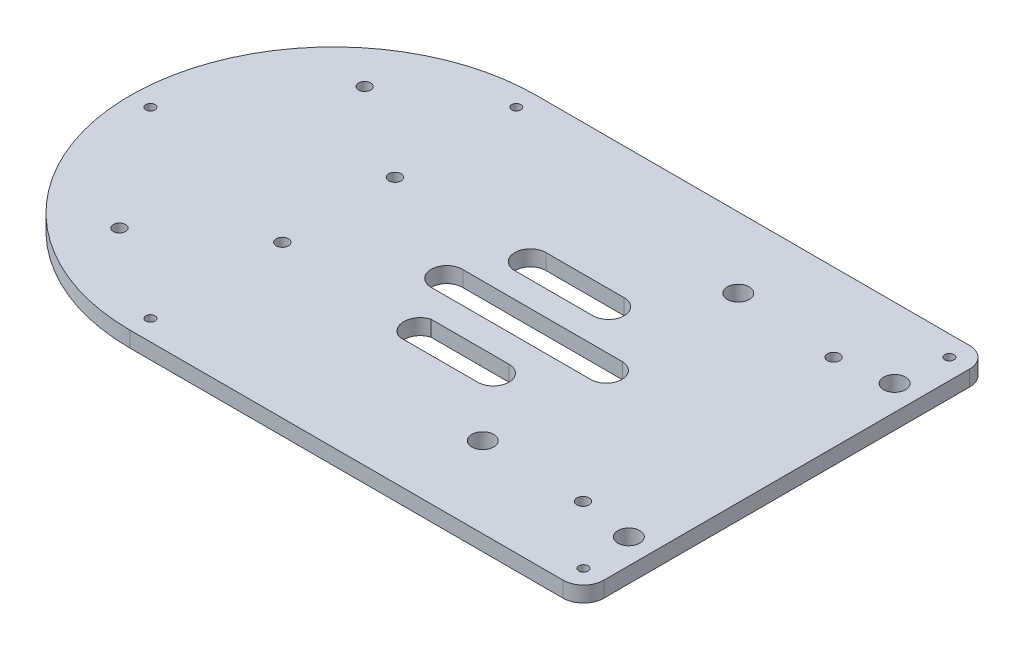
ISO-10303-21;
HEADER;
FILE_DESCRIPTION(('STEP AP214'),'2;1');
FILE_NAME('part.step','',(''),(''),'','','');
FILE_SCHEMA(('AUTOMOTIVE_DESIGN { 1 0 10303 214 1 1 1 1 }'));
ENDSEC;
DATA;
#1=APPLICATION_CONTEXT('core data for automotive mechanical design processes');
#2=APPLICATION_PROTOCOL_DEFINITION('international standard','automotive_design',2000,#1);
#3=PRODUCT_CONTEXT('',#1,'mechanical');
#4=PRODUCT('Part','Part','',(#3));
#5=PRODUCT_RELATED_PRODUCT_CATEGORY('part','',(#4));
#6=PRODUCT_DEFINITION_FORMATION('','',#4);
#7=PRODUCT_DEFINITION_CONTEXT('part definition',#1,'design');
#8=PRODUCT_DEFINITION('design','',#6,#7);
#9=PRODUCT_DEFINITION_SHAPE('','',#8);
#10=(LENGTH_UNIT() NAMED_UNIT(*) SI_UNIT(.MILLI.,.METRE.));
#11=(NAMED_UNIT(*) PLANE_ANGLE_UNIT() SI_UNIT($,.RADIAN.));
#12=(NAMED_UNIT(*) SI_UNIT($,.STERADIAN.) SOLID_ANGLE_UNIT());
#13=UNCERTAINTY_MEASURE_WITH_UNIT(LENGTH_MEASURE(1.E-05),#10,'distance_accuracy_value','');
#14=(GEOMETRIC_REPRESENTATION_CONTEXT(3) GLOBAL_UNCERTAINTY_ASSIGNED_CONTEXT((#13)) GLOBAL_UNIT_ASSIGNED_CONTEXT((#10,
#11,#12)) REPRESENTATION_CONTEXT('',''));
#15=CARTESIAN_POINT('',(0.,0.,0.));
#16=DIRECTION('',(0.,0.,1.));
#17=DIRECTION('',(1.,0.,0.));
#18=AXIS2_PLACEMENT_3D('',#15,#16,#17);
#19=CARTESIAN_POINT('',(70.3364824793313,5.,-56.9191573080477));
#20=DIRECTION('',(0.,-1.,0.));
#21=DIRECTION('',(0.,0.,-1.));
#22=AXIS2_PLACEMENT_3D('',#19,#20,#21);
#23=PLANE('',#22);
#24=CARTESIAN_POINT('',(70.3364824793313,5.,-56.9191573080477));
#25=DIRECTION('',(0.,1.,0.));
#26=DIRECTION('',(0.,0.,1.));
#27=AXIS2_PLACEMENT_3D('',#24,#25,#26);
#28=CIRCLE('',#27,1.475);
#29=CARTESIAN_POINT('',(70.3364824793313,5.,-55.4441573080477));
#30=VERTEX_POINT('',#29);
#31=EDGE_CURVE('E201',#30,#30,#28,.T.);
#32=ORIENTED_EDGE('',*,*,#31,.F.);
#33=EDGE_LOOP('',(#32));
#34=FACE_BOUND('',#33,.T.);
#35=CARTESIAN_POINT('',(68.8364824793313,5.,-40.9192914593731));
#36=DIRECTION('',(0.,1.,0.));
#37=DIRECTION('',(0.,0.,1.));
#38=AXIS2_PLACEMENT_3D('',#35,#36,#37);
#39=CIRCLE('',#38,3.49999999999995);
#40=CARTESIAN_POINT('',(68.8364824793313,5.,-37.4192914593732));
#41=VERTEX_POINT('',#40);
#42=EDGE_CURVE('E207',#41,#41,#39,.T.);
#43=ORIENTED_EDGE('',*,*,#42,.F.);
#44=EDGE_LOOP('',(#43));
#45=FACE_BOUND('',#44,.T.);
#46=CARTESIAN_POINT('',(51.8364824793313,5.,-38.4191573080477));
#47=DIRECTION('',(0.,1.,0.));
#48=DIRECTION('',(0.,0.,1.));
#49=AXIS2_PLACEMENT_3D('',#46,#47,#48);
#50=CIRCLE('',#49,1.95);
#51=CARTESIAN_POINT('',(51.8364824793313,5.,-36.4691573080477));
#52=VERTEX_POINT('',#51);
#53=EDGE_CURVE('E213',#52,#52,#50,.T.);
#54=ORIENTED_EDGE('',*,*,#53,.F.);
#55=EDGE_LOOP('',(#54));
#56=FACE_BOUND('',#55,.T.);
#57=CARTESIAN_POINT('',(-98.1635175206687,5.,-38.4191573080472));
#58=DIRECTION('',(0.,1.,0.));
#59=DIRECTION('',(0.,0.,1.));
#60=AXIS2_PLACEMENT_3D('',#57,#58,#59);
#61=CIRCLE('',#60,1.95);
#62=CARTESIAN_POINT('',(-98.1635175206687,5.,-36.4691573080472));
#63=VERTEX_POINT('',#62);
#64=EDGE_CURVE('E219',#63,#63,#61,.T.);
#65=ORIENTED_EDGE('',*,*,#64,.F.);
#66=EDGE_LOOP('',(#65));
#67=FACE_BOUND('',#66,.T.);
#68=CARTESIAN_POINT('',(-68.1635175206687,5.,-18.1096480939233));
#69=DIRECTION('',(0.,1.,0.));
#70=DIRECTION('',(0.,0.,1.));
#71=AXIS2_PLACEMENT_3D('',#68,#69,#70);
#72=CIRCLE('',#71,1.975);
#73=CARTESIAN_POINT('',(-68.1635175206687,5.,-16.1346480939233));
#74=VERTEX_POINT('',#73);
#75=EDGE_CURVE('E225',#74,#74,#72,.T.);
#76=ORIENTED_EDGE('',*,*,#75,.F.);
#77=EDGE_LOOP('',(#76));
#78=FACE_BOUND('',#77,.T.);
#79=CARTESIAN_POINT('',(18.8364824793314,5.,-40.9192914593731));
#80=DIRECTION('',(0.,1.,0.));
#81=DIRECTION('',(0.,0.,1.));
#82=AXIS2_PLACEMENT_3D('',#79,#80,#81);
#83=CIRCLE('',#82,3.5);
#84=CARTESIAN_POINT('',(18.8364824793314,5.,-37.4192914593731));
#85=VERTEX_POINT('',#84);
#86=EDGE_CURVE('E231',#85,#85,#83,.T.);
#87=ORIENTED_EDGE('',*,*,#86,.F.);
#88=EDGE_LOOP('',(#87));
#89=FACE_BOUND('',#88,.T.);
#90=CARTESIAN_POINT('',(-23.1635172737145,5.,-16.4191573459248));
#91=DIRECTION('',(0.,1.,0.));
#92=DIRECTION('',(0.,0.,1.));
#93=AXIS2_PLACEMENT_3D('',#90,#91,#92);
#94=CIRCLE('',#93,5.);
#95=CARTESIAN_POINT('',(-23.1635172737145,5.,-21.4191573459248));
#96=VERTEX_POINT('',#95);
#97=CARTESIAN_POINT('',(-23.1635172737145,5.,-11.4191573459248));
#98=VERTEX_POINT('',#97);
#99=EDGE_CURVE('E237',#96,#98,#94,.T.);
#100=ORIENTED_EDGE('',*,*,#99,.F.);
#101=DIRECTION('',(-1.,0.,0.));
#102=VECTOR('',#101,1.);
#103=CARTESIAN_POINT('',(-23.1635172737145,5.,-21.4191573459248));
#104=LINE('',#103,#102);
#105=CARTESIAN_POINT('',(1.8364824793313,5.,-21.4191573459248));
#106=VERTEX_POINT('',#105);
#107=EDGE_CURVE('E245',#106,#96,#104,.T.);
#108=ORIENTED_EDGE('',*,*,#107,.F.);
#109=CARTESIAN_POINT('',(1.83648247933132,5.,-16.4191573459248));
#110=DIRECTION('',(0.,1.,0.));
#111=DIRECTION('',(0.,0.,-1.));
#112=AXIS2_PLACEMENT_3D('',#109,#110,#111);
#113=CIRCLE('',#112,5.);
#114=CARTESIAN_POINT('',(1.83648247933133,5.,-11.4191573459248));
#115=VERTEX_POINT('',#114);
#116=EDGE_CURVE('E242',#115,#106,#113,.T.);
#117=ORIENTED_EDGE('',*,*,#116,.F.);
#118=DIRECTION('',(1.,0.,0.));
#119=VECTOR('',#118,1.);
#120=CARTESIAN_POINT('',(-23.1635172737145,5.,-11.4191573459248));
#121=LINE('',#120,#119);
#122=EDGE_CURVE('E239',#98,#115,#121,.T.);
#123=ORIENTED_EDGE('',*,*,#122,.F.);
#124=EDGE_LOOP('',(#100,#108,#117,#123));
#125=FACE_BOUND('',#124,.T.);
#126=CARTESIAN_POINT('',(70.3364824793313,5.,-56.9191573080477));
#127=DIRECTION('',(0.,1.,0.));
#128=DIRECTION('',(0.,0.,-1.));
#129=AXIS2_PLACEMENT_3D('',#126,#127,#128);
#130=CIRCLE('',#129,6.5);
#131=CARTESIAN_POINT('',(76.8364824793313,5.,-56.9191573080477));
#132=VERTEX_POINT('',#131);
#133=CARTESIAN_POINT('',(70.3364824793313,5.,-63.4191573080476));
#134=VERTEX_POINT('',#133);
#135=EDGE_CURVE('E299',#132,#134,#130,.T.);
#136=ORIENTED_EDGE('',*,*,#135,.T.);
#137=DIRECTION('',(-1.,0.,0.));
#138=VECTOR('',#137,1.);
#139=CARTESIAN_POINT('',(70.3364824793313,5.,-63.4191573080476));
#140=LINE('',#139,#138);
#141=CARTESIAN_POINT('',(-68.1635175206687,5.,-63.4191573080476));
#142=VERTEX_POINT('',#141);
#143=EDGE_CURVE('E302',#134,#142,#140,.T.);
#144=ORIENTED_EDGE('',*,*,#143,.T.);
#145=CARTESIAN_POINT('',(-68.1666068794609,5.,1.58084261853593));
#146=DIRECTION('',(0.,1.,0.));
#147=DIRECTION('',(0.,0.,1.));
#148=AXIS2_PLACEMENT_3D('',#145,#146,#147);
#149=CIRCLE('',#148,65.);
#150=CARTESIAN_POINT('',(-68.1635175206686,5.,66.5808425451195));
#151=VERTEX_POINT('',#150);
#152=EDGE_CURVE('E305',#142,#151,#149,.T.);
#153=ORIENTED_EDGE('',*,*,#152,.T.);
#154=DIRECTION('',(1.,0.,1.06016509249762E-09));
#155=VECTOR('',#154,1.);
#156=CARTESIAN_POINT('',(70.3364824793313,5.,66.5808426919524));
#157=LINE('',#156,#155);
#158=CARTESIAN_POINT('',(70.3364824793313,5.,66.5808426919523));
#159=VERTEX_POINT('',#158);
#160=EDGE_CURVE('E307',#151,#159,#157,.T.);
#161=ORIENTED_EDGE('',*,*,#160,.T.);
#162=CARTESIAN_POINT('',(70.3364824793313,5.,60.0808426919523));
#163=DIRECTION('',(0.,1.,0.));
#164=DIRECTION('',(0.,0.,1.));
#165=AXIS2_PLACEMENT_3D('',#162,#163,#164);
#166=CIRCLE('',#165,6.5);
#167=CARTESIAN_POINT('',(76.8364824793313,5.,60.0808425451196));
#168=VERTEX_POINT('',#167);
#169=EDGE_CURVE('E309',#159,#168,#166,.T.);
#170=ORIENTED_EDGE('',*,*,#169,.T.);
#171=DIRECTION('',(0.,0.,-1.));
#172=VECTOR('',#171,1.);
#173=CARTESIAN_POINT('',(76.8364824793313,5.,-56.9191573080477));
#174=LINE('',#173,#172);
#175=EDGE_CURVE('E311',#168,#132,#174,.T.);
#176=ORIENTED_EDGE('',*,*,#175,.T.);
#177=EDGE_LOOP('',(#136,#144,#153,#161,#170,#176));
#178=FACE_BOUND('',#177,.T.);
#179=CARTESIAN_POINT('',(-31.8788270323601,5.,1.58084265407521));
#180=DIRECTION('',(0.,1.,0.));
#181=DIRECTION('',(0.,0.,1.));
#182=AXIS2_PLACEMENT_3D('',#179,#180,#181);
#183=CIRCLE('',#182,5.00463367149133);
#184=CARTESIAN_POINT('',(-31.6635175206687,5.,-3.41915734592479));
#185=VERTEX_POINT('',#184);
#186=CARTESIAN_POINT('',(-32.0941365440516,5.,6.58084265407521));
#187=VERTEX_POINT('',#186);
#188=EDGE_CURVE('E268',#185,#187,#183,.T.);
#189=ORIENTED_EDGE('',*,*,#188,.F.);
#190=DIRECTION('',(-1.,0.,0.));
#191=VECTOR('',#190,1.);
#192=CARTESIAN_POINT('',(-31.6635175206687,5.,-3.41915734592479));
#193=LINE('',#192,#191);
#194=CARTESIAN_POINT('',(19.3364824793313,5.,-3.41915734592479));
#195=VERTEX_POINT('',#194);
#196=EDGE_CURVE('E276',#195,#185,#193,.T.);
#197=ORIENTED_EDGE('',*,*,#196,.F.);
#198=CARTESIAN_POINT('',(19.1211729676399,5.,1.58084265407521));
#199=DIRECTION('',(0.,1.,0.));
#200=DIRECTION('',(0.,0.,-1.));
#201=AXIS2_PLACEMENT_3D('',#198,#199,#200);
#202=CIRCLE('',#201,5.00463367149132);
#203=CARTESIAN_POINT('',(18.9058634559484,5.,6.5808426540752));
#204=VERTEX_POINT('',#203);
#205=EDGE_CURVE('E273',#204,#195,#202,.T.);
#206=ORIENTED_EDGE('',*,*,#205,.F.);
#207=DIRECTION('',(1.,0.,0.));
#208=VECTOR('',#207,1.);
#209=CARTESIAN_POINT('',(-32.0941365440516,5.,6.58084265407521));
#210=LINE('',#209,#208);
#211=EDGE_CURVE('E270',#187,#204,#210,.T.);
#212=ORIENTED_EDGE('',*,*,#211,.F.);
#213=EDGE_LOOP('',(#189,#197,#206,#212));
#214=FACE_BOUND('',#213,.T.);
#215=CARTESIAN_POINT('',(1.83339312053904,5.,20.4196532693301));
#216=DIRECTION('',(0.,1.,0.));
#217=DIRECTION('',(0.,0.,1.));
#218=AXIS2_PLACEMENT_3D('',#215,#216,#217);
#219=CIRCLE('',#218,5.);
#220=CARTESIAN_POINT('',(1.83339312053903,5.,25.4196532693301));
#221=VERTEX_POINT('',#220);
#222=CARTESIAN_POINT('',(1.83339312053904,5.,15.4196532693301));
#223=VERTEX_POINT('',#222);
#224=EDGE_CURVE('E162',#221,#223,#219,.T.);
#225=ORIENTED_EDGE('',*,*,#224,.F.);
#226=DIRECTION('',(1.,0.,0.));
#227=VECTOR('',#226,1.);
#228=CARTESIAN_POINT('',(-23.166606879461,5.,25.4196532693301));
#229=LINE('',#228,#227);
#230=CARTESIAN_POINT('',(-23.166606879461,5.,25.4196532693301));
#231=VERTEX_POINT('',#230);
#232=EDGE_CURVE('E185',#231,#221,#229,.T.);
#233=ORIENTED_EDGE('',*,*,#232,.F.);
#234=CARTESIAN_POINT('',(-21.5232173098339,5.,20.4196532693301));
#235=DIRECTION('',(0.,1.,0.));
#236=DIRECTION('',(0.,0.,1.));
#237=AXIS2_PLACEMENT_3D('',#234,#235,#236);
#238=CIRCLE('',#237,5.26314822872767);
#239=CARTESIAN_POINT('',(-23.166606879461,5.,15.4196532693301));
#240=VERTEX_POINT('',#239);
#241=EDGE_CURVE('E183',#240,#231,#238,.T.);
#242=ORIENTED_EDGE('',*,*,#241,.F.);
#243=DIRECTION('',(-1.,0.,0.));
#244=VECTOR('',#243,1.);
#245=CARTESIAN_POINT('',(-23.166606879461,5.,15.4196532693301));
#246=LINE('',#245,#244);
#247=EDGE_CURVE('E170',#223,#240,#246,.T.);
#248=ORIENTED_EDGE('',*,*,#247,.F.);
#249=EDGE_LOOP('',(#225,#233,#242,#248));
#250=FACE_BOUND('',#249,.T.);
#251=CARTESIAN_POINT('',(18.8364824793314,5.,40.8007481239956));
#252=DIRECTION('',(0.,1.,0.));
#253=DIRECTION('',(0.,0.,-1.));
#254=AXIS2_PLACEMENT_3D('',#251,#252,#253);
#255=CIRCLE('',#254,3.5);
#256=CARTESIAN_POINT('',(18.8364824793314,5.,37.3007481239956));
#257=VERTEX_POINT('',#256);
#258=EDGE_CURVE('E191',#257,#257,#255,.T.);
#259=ORIENTED_EDGE('',*,*,#258,.F.);
#260=EDGE_LOOP('',(#259));
#261=FACE_BOUND('',#260,.T.);
#262=CARTESIAN_POINT('',(70.3364824793313,5.,60.0808426919523));
#263=DIRECTION('',(0.,1.,0.));
#264=DIRECTION('',(0.,0.,-1.));
#265=AXIS2_PLACEMENT_3D('',#262,#263,#264);
#266=CIRCLE('',#265,1.47500000000001);
#267=CARTESIAN_POINT('',(70.3364824793313,5.,58.6058426919523));
#268=VERTEX_POINT('',#267);
#269=EDGE_CURVE('E537',#268,#268,#266,.T.);
#270=ORIENTED_EDGE('',*,*,#269,.F.);
#271=EDGE_LOOP('',(#270));
#272=FACE_BOUND('',#271,.T.);
#273=CARTESIAN_POINT('',(51.685487166698,5.,41.5807001944227));
#274=DIRECTION('',(0.,1.,0.));
#275=DIRECTION('',(0.,0.,-1.));
#276=AXIS2_PLACEMENT_3D('',#273,#274,#275);
#277=CIRCLE('',#276,1.95);
#278=CARTESIAN_POINT('',(51.685487166698,5.,39.6307001944227));
#279=VERTEX_POINT('',#278);
#280=EDGE_CURVE('E531',#279,#279,#277,.T.);
#281=ORIENTED_EDGE('',*,*,#280,.F.);
#282=EDGE_LOOP('',(#281));
#283=FACE_BOUND('',#282,.T.);
#284=CARTESIAN_POINT('',(68.8364824793313,5.,44.0807085406269));
#285=DIRECTION('',(0.,1.,0.));
#286=DIRECTION('',(0.,0.,-1.));
#287=AXIS2_PLACEMENT_3D('',#284,#285,#286);
#288=CIRCLE('',#287,3.50000000000001);
#289=CARTESIAN_POINT('',(68.8364824793313,5.,40.5807085406269));
#290=VERTEX_POINT('',#289);
#291=EDGE_CURVE('E525',#290,#290,#288,.T.);
#292=ORIENTED_EDGE('',*,*,#291,.F.);
#293=EDGE_LOOP('',(#292));
#294=FACE_BOUND('',#293,.T.);
#295=CARTESIAN_POINT('',(-68.1635175206687,5.,-56.9191573080476));
#296=DIRECTION('',(0.,1.,0.));
#297=DIRECTION('',(0.,0.,1.));
#298=AXIS2_PLACEMENT_3D('',#295,#296,#297);
#299=CIRCLE('',#298,1.475);
#300=CARTESIAN_POINT('',(-68.1635175206687,5.,-55.4441573080477));
#301=VERTEX_POINT('',#300);
#302=EDGE_CURVE('E519',#301,#301,#299,.T.);
#303=ORIENTED_EDGE('',*,*,#302,.F.);
#304=EDGE_LOOP('',(#303));
#305=FACE_BOUND('',#304,.T.);
#306=CARTESIAN_POINT('',(-68.1635175206687,5.,17.8903519060767));
#307=DIRECTION('',(0.,1.,0.));
#308=DIRECTION('',(0.,0.,-1.));
#309=AXIS2_PLACEMENT_3D('',#306,#307,#308);
#310=CIRCLE('',#309,1.975);
#311=CARTESIAN_POINT('',(-68.1635175206687,5.,15.9153519060767));
#312=VERTEX_POINT('',#311);
#313=EDGE_CURVE('E513',#312,#312,#310,.T.);
#314=ORIENTED_EDGE('',*,*,#313,.F.);
#315=EDGE_LOOP('',(#314));
#316=FACE_BOUND('',#315,.T.);
#317=CARTESIAN_POINT('',(-98.1635175206687,5.,40.0000000355393));
#318=DIRECTION('',(0.,1.,0.));
#319=DIRECTION('',(0.,0.,-1.));
#320=AXIS2_PLACEMENT_3D('',#317,#318,#319);
#321=CIRCLE('',#320,1.95);
#322=CARTESIAN_POINT('',(-98.1635175206687,5.,38.0500000355393));
#323=VERTEX_POINT('',#322);
#324=EDGE_CURVE('E507',#323,#323,#321,.T.);
#325=ORIENTED_EDGE('',*,*,#324,.F.);
#326=EDGE_LOOP('',(#325));
#327=FACE_BOUND('',#326,.T.);
#328=CARTESIAN_POINT('',(-68.1635175206687,5.,60.0808425451195));
#329=DIRECTION('',(0.,1.,0.));
#330=DIRECTION('',(0.,0.,-1.));
#331=AXIS2_PLACEMENT_3D('',#328,#329,#330);
#332=CIRCLE('',#331,1.475);
#333=CARTESIAN_POINT('',(-68.1635175206687,5.,58.6058425451195));
#334=VERTEX_POINT('',#333);
#335=EDGE_CURVE('E501',#334,#334,#332,.T.);
#336=ORIENTED_EDGE('',*,*,#335,.F.);
#337=EDGE_LOOP('',(#336));
#338=FACE_BOUND('',#337,.T.);
#339=CARTESIAN_POINT('',(-126.663517520669,5.,1.58084261853595));
#340=DIRECTION('',(0.,1.,0.));
#341=DIRECTION('',(0.,0.,1.));
#342=AXIS2_PLACEMENT_3D('',#339,#340,#341);
#343=CIRCLE('',#342,1.47500000000001);
#344=CARTESIAN_POINT('',(-126.663517520669,5.,3.05584261853597));
#345=VERTEX_POINT('',#344);
#346=EDGE_CURVE('E492',#345,#345,#343,.T.);
#347=ORIENTED_EDGE('',*,*,#346,.F.);
#348=EDGE_LOOP('',(#347));
#349=FACE_BOUND('',#348,.T.);
#350=ADVANCED_FACE('F37',(#34,#45,#56,#67,#78,#89,#125,#178,#214,#250,#261,#272,#283,#294,#305,
#316,#327,#338,#349),#23,.F.);
#351=CARTESIAN_POINT('',(70.3364824793313,0.,-56.9191573080477));
#352=DIRECTION('',(0.,-1.,0.));
#353=DIRECTION('',(0.,0.,-1.));
#354=AXIS2_PLACEMENT_3D('',#351,#352,#353);
#355=PLANE('',#354);
#356=CARTESIAN_POINT('',(-68.1635175206687,0.,60.0808425451195));
#357=DIRECTION('',(0.,1.,0.));
#358=DIRECTION('',(0.,0.,-1.));
#359=AXIS2_PLACEMENT_3D('',#356,#357,#358);
#360=CIRCLE('',#359,1.475);
#361=CARTESIAN_POINT('',(-68.1635175206687,0.,58.6058425451195));
#362=VERTEX_POINT('',#361);
#363=EDGE_CURVE('E498',#362,#362,#360,.T.);
#364=ORIENTED_EDGE('',*,*,#363,.T.);
#365=EDGE_LOOP('',(#364));
#366=FACE_BOUND('',#365,.T.);
#367=CARTESIAN_POINT('',(-68.1635175206687,0.,17.8903519060767));
#368=DIRECTION('',(0.,1.,0.));
#369=DIRECTION('',(0.,0.,-1.));
#370=AXIS2_PLACEMENT_3D('',#367,#368,#369);
#371=CIRCLE('',#370,1.975);
#372=CARTESIAN_POINT('',(-68.1635175206687,0.,15.9153519060767));
#373=VERTEX_POINT('',#372);
#374=EDGE_CURVE('E510',#373,#373,#371,.T.);
#375=ORIENTED_EDGE('',*,*,#374,.T.);
#376=EDGE_LOOP('',(#375));
#377=FACE_BOUND('',#376,.T.);
#378=CARTESIAN_POINT('',(68.8364824793313,0.,44.0807085406269));
#379=DIRECTION('',(0.,1.,0.));
#380=DIRECTION('',(0.,0.,-1.));
#381=AXIS2_PLACEMENT_3D('',#378,#379,#380);
#382=CIRCLE('',#381,3.50000000000001);
#383=CARTESIAN_POINT('',(68.8364824793313,0.,40.5807085406269));
#384=VERTEX_POINT('',#383);
#385=EDGE_CURVE('E522',#384,#384,#382,.T.);
#386=ORIENTED_EDGE('',*,*,#385,.T.);
#387=EDGE_LOOP('',(#386));
#388=FACE_BOUND('',#387,.T.);
#389=CARTESIAN_POINT('',(70.3364824793313,0.,60.0808426919523));
#390=DIRECTION('',(0.,1.,0.));
#391=DIRECTION('',(0.,0.,-1.));
#392=AXIS2_PLACEMENT_3D('',#389,#390,#391);
#393=CIRCLE('',#392,1.47500000000001);
#394=CARTESIAN_POINT('',(70.3364824793313,0.,58.6058426919523));
#395=VERTEX_POINT('',#394);
#396=EDGE_CURVE('E534',#395,#395,#393,.T.);
#397=ORIENTED_EDGE('',*,*,#396,.T.);
#398=EDGE_LOOP('',(#397));
#399=FACE_BOUND('',#398,.T.);
#400=DIRECTION('',(1.,0.,0.));
#401=VECTOR('',#400,1.);
#402=CARTESIAN_POINT('',(-23.166606879461,0.,25.4196532693301));
#403=LINE('',#402,#401);
#404=CARTESIAN_POINT('',(-23.166606879461,0.,25.4196532693301));
#405=VERTEX_POINT('',#404);
#406=CARTESIAN_POINT('',(1.83339312053903,0.,25.4196532693301));
#407=VERTEX_POINT('',#406);
#408=EDGE_CURVE('E171',#405,#407,#403,.T.);
#409=ORIENTED_EDGE('',*,*,#408,.T.);
#410=CARTESIAN_POINT('',(1.83339312053904,0.,20.4196532693301));
#411=DIRECTION('',(0.,1.,0.));
#412=DIRECTION('',(0.,0.,1.));
#413=AXIS2_PLACEMENT_3D('',#410,#411,#412);
#414=CIRCLE('',#413,5.);
#415=CARTESIAN_POINT('',(1.83339312053904,0.,15.4196532693301));
#416=VERTEX_POINT('',#415);
#417=EDGE_CURVE('E60',#407,#416,#414,.T.);
#418=ORIENTED_EDGE('',*,*,#417,.T.);
#419=DIRECTION('',(-1.,0.,0.));
#420=VECTOR('',#419,1.);
#421=CARTESIAN_POINT('',(-23.166606879461,0.,15.4196532693301));
#422=LINE('',#421,#420);
#423=CARTESIAN_POINT('',(-23.166606879461,0.,15.4196532693301));
#424=VERTEX_POINT('',#423);
#425=EDGE_CURVE('E177',#416,#424,#422,.T.);
#426=ORIENTED_EDGE('',*,*,#425,.T.);
#427=CARTESIAN_POINT('',(-21.5232173098339,0.,20.4196532693301));
#428=DIRECTION('',(0.,1.,0.));
#429=DIRECTION('',(0.,0.,1.));
#430=AXIS2_PLACEMENT_3D('',#427,#428,#429);
#431=CIRCLE('',#430,5.26314822872767);
#432=EDGE_CURVE('E193',#424,#405,#431,.T.);
#433=ORIENTED_EDGE('',*,*,#432,.T.);
#434=EDGE_LOOP('',(#409,#418,#426,#433));
#435=FACE_BOUND('',#434,.T.);
#436=CARTESIAN_POINT('',(70.3364824793313,0.,-56.9191573080477));
#437=DIRECTION('',(0.,1.,0.));
#438=DIRECTION('',(0.,0.,1.));
#439=AXIS2_PLACEMENT_3D('',#436,#437,#438);
#440=CIRCLE('',#439,1.475);
#441=CARTESIAN_POINT('',(70.3364824793313,0.,-55.4441573080477));
#442=VERTEX_POINT('',#441);
#443=EDGE_CURVE('E178',#442,#442,#440,.T.);
#444=ORIENTED_EDGE('',*,*,#443,.T.);
#445=EDGE_LOOP('',(#444));
#446=FACE_BOUND('',#445,.T.);
#447=CARTESIAN_POINT('',(51.8364824793313,0.,-38.4191573080477));
#448=DIRECTION('',(0.,1.,0.));
#449=DIRECTION('',(0.,0.,1.));
#450=AXIS2_PLACEMENT_3D('',#447,#448,#449);
#451=CIRCLE('',#450,1.95);
#452=CARTESIAN_POINT('',(51.8364824793313,0.,-36.4691573080477));
#453=VERTEX_POINT('',#452);
#454=EDGE_CURVE('E210',#453,#453,#451,.T.);
#455=ORIENTED_EDGE('',*,*,#454,.T.);
#456=EDGE_LOOP('',(#455));
#457=FACE_BOUND('',#456,.T.);
#458=CARTESIAN_POINT('',(-68.1635175206687,0.,-18.1096480939233));
#459=DIRECTION('',(0.,1.,0.));
#460=DIRECTION('',(0.,0.,1.));
#461=AXIS2_PLACEMENT_3D('',#458,#459,#460);
#462=CIRCLE('',#461,1.975);
#463=CARTESIAN_POINT('',(-68.1635175206687,0.,-16.1346480939233));
#464=VERTEX_POINT('',#463);
#465=EDGE_CURVE('E222',#464,#464,#462,.T.);
#466=ORIENTED_EDGE('',*,*,#465,.T.);
#467=EDGE_LOOP('',(#466));
#468=FACE_BOUND('',#467,.T.);
#469=DIRECTION('',(-1.,0.,0.));
#470=VECTOR('',#469,1.);
#471=CARTESIAN_POINT('',(-23.1635172737145,0.,-21.4191573459248));
#472=LINE('',#471,#470);
#473=CARTESIAN_POINT('',(1.8364824793313,0.,-21.4191573459248));
#474=VERTEX_POINT('',#473);
#475=CARTESIAN_POINT('',(-23.1635172737145,0.,-21.4191573459248));
#476=VERTEX_POINT('',#475);
#477=EDGE_CURVE('E240',#474,#476,#472,.T.);
#478=ORIENTED_EDGE('',*,*,#477,.T.);
#479=CARTESIAN_POINT('',(-23.1635172737145,0.,-16.4191573459248));
#480=DIRECTION('',(0.,1.,0.));
#481=DIRECTION('',(0.,0.,1.));
#482=AXIS2_PLACEMENT_3D('',#479,#480,#481);
#483=CIRCLE('',#482,5.);
#484=CARTESIAN_POINT('',(-23.1635172737145,0.,-11.4191573459248));
#485=VERTEX_POINT('',#484);
#486=EDGE_CURVE('E234',#476,#485,#483,.T.);
#487=ORIENTED_EDGE('',*,*,#486,.T.);
#488=DIRECTION('',(1.,0.,0.));
#489=VECTOR('',#488,1.);
#490=CARTESIAN_POINT('',(-23.1635172737145,0.,-11.4191573459248));
#491=LINE('',#490,#489);
#492=CARTESIAN_POINT('',(1.83648247933133,0.,-11.4191573459248));
#493=VERTEX_POINT('',#492);
#494=EDGE_CURVE('E250',#485,#493,#491,.T.);
#495=ORIENTED_EDGE('',*,*,#494,.T.);
#496=CARTESIAN_POINT('',(1.83648247933132,0.,-16.4191573459248));
#497=DIRECTION('',(0.,1.,0.));
#498=DIRECTION('',(0.,0.,-1.));
#499=AXIS2_PLACEMENT_3D('',#496,#497,#498);
#500=CIRCLE('',#499,5.);
#501=EDGE_CURVE('E253',#493,#474,#500,.T.);
#502=ORIENTED_EDGE('',*,*,#501,.T.);
#503=EDGE_LOOP('',(#478,#487,#495,#502));
#504=FACE_BOUND('',#503,.T.);
#505=DIRECTION('',(-1.,0.,0.));
#506=VECTOR('',#505,1.);
#507=CARTESIAN_POINT('',(-31.6635175206687,0.,-3.41915734592479));
#508=LINE('',#507,#506);
#509=CARTESIAN_POINT('',(19.3364824793313,0.,-3.41915734592479));
#510=VERTEX_POINT('',#509);
#511=CARTESIAN_POINT('',(-31.6635175206687,0.,-3.41915734592479));
#512=VERTEX_POINT('',#511);
#513=EDGE_CURVE('E271',#510,#512,#508,.T.);
#514=ORIENTED_EDGE('',*,*,#513,.T.);
#515=CARTESIAN_POINT('',(-31.8788270323601,0.,1.58084265407521));
#516=DIRECTION('',(0.,1.,0.));
#517=DIRECTION('',(0.,0.,1.));
#518=AXIS2_PLACEMENT_3D('',#515,#516,#517);
#519=CIRCLE('',#518,5.00463367149133);
#520=CARTESIAN_POINT('',(-32.0941365440516,0.,6.58084265407521));
#521=VERTEX_POINT('',#520);
#522=EDGE_CURVE('E267',#512,#521,#519,.T.);
#523=ORIENTED_EDGE('',*,*,#522,.T.);
#524=DIRECTION('',(1.,0.,0.));
#525=VECTOR('',#524,1.);
#526=CARTESIAN_POINT('',(-32.0941365440516,0.,6.58084265407521));
#527=LINE('',#526,#525);
#528=CARTESIAN_POINT('',(18.9058634559484,0.,6.5808426540752));
#529=VERTEX_POINT('',#528);
#530=EDGE_CURVE('E281',#521,#529,#527,.T.);
#531=ORIENTED_EDGE('',*,*,#530,.T.);
#532=CARTESIAN_POINT('',(19.1211729676399,0.,1.58084265407521));
#533=DIRECTION('',(0.,1.,0.));
#534=DIRECTION('',(0.,0.,-1.));
#535=AXIS2_PLACEMENT_3D('',#532,#533,#534);
#536=CIRCLE('',#535,5.00463367149132);
#537=EDGE_CURVE('E284',#529,#510,#536,.T.);
#538=ORIENTED_EDGE('',*,*,#537,.T.);
#539=EDGE_LOOP('',(#514,#523,#531,#538));
#540=FACE_BOUND('',#539,.T.);
#541=CARTESIAN_POINT('',(70.3364824793313,0.,-56.9191573080477));
#542=DIRECTION('',(0.,1.,0.));
#543=DIRECTION('',(0.,0.,-1.));
#544=AXIS2_PLACEMENT_3D('',#541,#542,#543);
#545=CIRCLE('',#544,6.5);
#546=CARTESIAN_POINT('',(76.8364824793313,0.,-56.9191573080477));
#547=VERTEX_POINT('',#546);
#548=CARTESIAN_POINT('',(70.3364824793313,0.,-63.4191573080476));
#549=VERTEX_POINT('',#548);
#550=EDGE_CURVE('E298',#547,#549,#545,.T.);
#551=ORIENTED_EDGE('',*,*,#550,.F.);
#552=DIRECTION('',(0.,0.,-1.));
#553=VECTOR('',#552,1.);
#554=CARTESIAN_POINT('',(76.8364824793313,0.,-56.9191573080477));
#555=LINE('',#554,#553);
#556=CARTESIAN_POINT('',(76.8364824793313,0.,60.0808425451196));
#557=VERTEX_POINT('',#556);
#558=EDGE_CURVE('E303',#557,#547,#555,.T.);
#559=ORIENTED_EDGE('',*,*,#558,.F.);
#560=CARTESIAN_POINT('',(70.3364824793313,0.,60.0808426919523));
#561=DIRECTION('',(0.,1.,0.));
#562=DIRECTION('',(0.,0.,1.));
#563=AXIS2_PLACEMENT_3D('',#560,#561,#562);
#564=CIRCLE('',#563,6.5);
#565=CARTESIAN_POINT('',(70.3364824793313,0.,66.5808426919523));
#566=VERTEX_POINT('',#565);
#567=EDGE_CURVE('E322',#566,#557,#564,.T.);
#568=ORIENTED_EDGE('',*,*,#567,.F.);
#569=DIRECTION('',(1.,0.,1.06016509249762E-09));
#570=VECTOR('',#569,1.);
#571=CARTESIAN_POINT('',(70.3364824793313,0.,66.5808426919524));
#572=LINE('',#571,#570);
#573=CARTESIAN_POINT('',(-68.1635175206686,0.,66.5808425451195));
#574=VERTEX_POINT('',#573);
#575=EDGE_CURVE('E320',#574,#566,#572,.T.);
#576=ORIENTED_EDGE('',*,*,#575,.F.);
#577=CARTESIAN_POINT('',(-68.1666068794609,0.,1.58084261853593));
#578=DIRECTION('',(0.,1.,0.));
#579=DIRECTION('',(0.,0.,1.));
#580=AXIS2_PLACEMENT_3D('',#577,#578,#579);
#581=CIRCLE('',#580,65.);
#582=CARTESIAN_POINT('',(-68.1635175206687,0.,-63.4191573080476));
#583=VERTEX_POINT('',#582);
#584=EDGE_CURVE('E318',#583,#574,#581,.T.);
#585=ORIENTED_EDGE('',*,*,#584,.F.);
#586=DIRECTION('',(-1.,0.,0.));
#587=VECTOR('',#586,1.);
#588=CARTESIAN_POINT('',(70.3364824793313,0.,-63.4191573080476));
#589=LINE('',#588,#587);
#590=EDGE_CURVE('E316',#549,#583,#589,.T.);
#591=ORIENTED_EDGE('',*,*,#590,.F.);
#592=EDGE_LOOP('',(#551,#559,#568,#576,#585,#591));
#593=FACE_BOUND('',#592,.T.);
#594=CARTESIAN_POINT('',(18.8364824793314,0.,-40.9192914593731));
#595=DIRECTION('',(0.,1.,0.));
#596=DIRECTION('',(0.,0.,1.));
#597=AXIS2_PLACEMENT_3D('',#594,#595,#596);
#598=CIRCLE('',#597,3.5);
#599=CARTESIAN_POINT('',(18.8364824793314,0.,-37.4192914593731));
#600=VERTEX_POINT('',#599);
#601=EDGE_CURVE('E228',#600,#600,#598,.T.);
#602=ORIENTED_EDGE('',*,*,#601,.T.);
#603=EDGE_LOOP('',(#602));
#604=FACE_BOUND('',#603,.T.);
#605=CARTESIAN_POINT('',(-98.1635175206687,0.,-38.4191573080472));
#606=DIRECTION('',(0.,1.,0.));
#607=DIRECTION('',(0.,0.,1.));
#608=AXIS2_PLACEMENT_3D('',#605,#606,#607);
#609=CIRCLE('',#608,1.95);
#610=CARTESIAN_POINT('',(-98.1635175206687,0.,-36.4691573080472));
#611=VERTEX_POINT('',#610);
#612=EDGE_CURVE('E216',#611,#611,#609,.T.);
#613=ORIENTED_EDGE('',*,*,#612,.T.);
#614=EDGE_LOOP('',(#613));
#615=FACE_BOUND('',#614,.T.);
#616=CARTESIAN_POINT('',(68.8364824793313,0.,-40.9192914593731));
#617=DIRECTION('',(0.,1.,0.));
#618=DIRECTION('',(0.,0.,1.));
#619=AXIS2_PLACEMENT_3D('',#616,#617,#618);
#620=CIRCLE('',#619,3.49999999999995);
#621=CARTESIAN_POINT('',(68.8364824793313,0.,-37.4192914593732));
#622=VERTEX_POINT('',#621);
#623=EDGE_CURVE('E204',#622,#622,#620,.T.);
#624=ORIENTED_EDGE('',*,*,#623,.T.);
#625=EDGE_LOOP('',(#624));
#626=FACE_BOUND('',#625,.T.);
#627=CARTESIAN_POINT('',(18.8364824793314,0.,40.8007481239956));
#628=DIRECTION('',(0.,1.,0.));
#629=DIRECTION('',(0.,0.,-1.));
#630=AXIS2_PLACEMENT_3D('',#627,#628,#629);
#631=CIRCLE('',#630,3.5);
#632=CARTESIAN_POINT('',(18.8364824793314,0.,37.3007481239956));
#633=VERTEX_POINT('',#632);
#634=EDGE_CURVE('E540',#633,#633,#631,.T.);
#635=ORIENTED_EDGE('',*,*,#634,.T.);
#636=EDGE_LOOP('',(#635));
#637=FACE_BOUND('',#636,.T.);
#638=CARTESIAN_POINT('',(51.685487166698,0.,41.5807001944227));
#639=DIRECTION('',(0.,1.,0.));
#640=DIRECTION('',(0.,0.,-1.));
#641=AXIS2_PLACEMENT_3D('',#638,#639,#640);
#642=CIRCLE('',#641,1.95);
#643=CARTESIAN_POINT('',(51.685487166698,0.,39.6307001944227));
#644=VERTEX_POINT('',#643);
#645=EDGE_CURVE('E528',#644,#644,#642,.T.);
#646=ORIENTED_EDGE('',*,*,#645,.T.);
#647=EDGE_LOOP('',(#646));
#648=FACE_BOUND('',#647,.T.);
#649=CARTESIAN_POINT('',(-68.1635175206687,0.,-56.9191573080476));
#650=DIRECTION('',(0.,1.,0.));
#651=DIRECTION('',(0.,0.,1.));
#652=AXIS2_PLACEMENT_3D('',#649,#650,#651);
#653=CIRCLE('',#652,1.475);
#654=CARTESIAN_POINT('',(-68.1635175206687,0.,-55.4441573080477));
#655=VERTEX_POINT('',#654);
#656=EDGE_CURVE('E516',#655,#655,#653,.T.);
#657=ORIENTED_EDGE('',*,*,#656,.T.);
#658=EDGE_LOOP('',(#657));
#659=FACE_BOUND('',#658,.T.);
#660=CARTESIAN_POINT('',(-98.1635175206687,0.,40.0000000355393));
#661=DIRECTION('',(0.,1.,0.));
#662=DIRECTION('',(0.,0.,-1.));
#663=AXIS2_PLACEMENT_3D('',#660,#661,#662);
#664=CIRCLE('',#663,1.95);
#665=CARTESIAN_POINT('',(-98.1635175206687,0.,38.0500000355393));
#666=VERTEX_POINT('',#665);
#667=EDGE_CURVE('E504',#666,#666,#664,.T.);
#668=ORIENTED_EDGE('',*,*,#667,.T.);
#669=EDGE_LOOP('',(#668));
#670=FACE_BOUND('',#669,.T.);
#671=CARTESIAN_POINT('',(-126.663517520669,0.,1.58084261853595));
#672=DIRECTION('',(0.,1.,0.));
#673=DIRECTION('',(0.,0.,1.));
#674=AXIS2_PLACEMENT_3D('',#671,#672,#673);
#675=CIRCLE('',#674,1.47500000000001);
#676=CARTESIAN_POINT('',(-126.663517520669,0.,3.05584261853597));
#677=VERTEX_POINT('',#676);
#678=EDGE_CURVE('E495',#677,#677,#675,.T.);
#679=ORIENTED_EDGE('',*,*,#678,.T.);
#680=EDGE_LOOP('',(#679));
#681=FACE_BOUND('',#680,.T.);
#682=ADVANCED_FACE('F346',(#366,#377,#388,#399,#435,#446,#457,#468,#504,#540,#593,#604,#615,
#626,#637,#648,#659,#670,#681),#355,.T.);
#683=CARTESIAN_POINT('',(70.3364824793313,5.,-56.9191573080477));
#684=DIRECTION('',(0.,-1.,0.));
#685=DIRECTION('',(0.,0.,-1.));
#686=AXIS2_PLACEMENT_3D('',#683,#684,#685);
#687=CYLINDRICAL_SURFACE('',#686,6.5);
#688=ORIENTED_EDGE('',*,*,#550,.T.);
#689=DIRECTION('',(0.,-1.,0.));
#690=VECTOR('',#689,1.);
#691=CARTESIAN_POINT('',(70.3364824793313,5.,-63.4191573080476));
#692=LINE('',#691,#690);
#693=EDGE_CURVE('E11',#134,#549,#692,.T.);
#694=ORIENTED_EDGE('',*,*,#693,.F.);
#695=ORIENTED_EDGE('',*,*,#135,.F.);
#696=DIRECTION('',(0.,-1.,0.));
#697=VECTOR('',#696,1.);
#698=CARTESIAN_POINT('',(76.8364824793313,5.,-56.9191573080477));
#699=LINE('',#698,#697);
#700=EDGE_CURVE('E313',#132,#547,#699,.T.);
#701=ORIENTED_EDGE('',*,*,#700,.T.);
#702=EDGE_LOOP('',(#688,#694,#695,#701));
#703=FACE_BOUND('',#702,.T.);
#704=ADVANCED_FACE('F39',(#703),#687,.T.);
#705=CARTESIAN_POINT('',(70.3364824793313,5.,-63.4191573080476));
#706=DIRECTION('',(0.,0.,1.));
#707=DIRECTION('',(1.,0.,0.));
#708=AXIS2_PLACEMENT_3D('',#705,#706,#707);
#709=PLANE('',#708);
#710=ORIENTED_EDGE('',*,*,#590,.T.);
#711=DIRECTION('',(0.,-1.,0.));
#712=VECTOR('',#711,1.);
#713=CARTESIAN_POINT('',(-68.1635175206687,5.,-63.4191573080476));
#714=LINE('',#713,#712);
#715=EDGE_CURVE('E45',#142,#583,#714,.T.);
#716=ORIENTED_EDGE('',*,*,#715,.F.);
#717=ORIENTED_EDGE('',*,*,#143,.F.);
#718=ORIENTED_EDGE('',*,*,#693,.T.);
#719=EDGE_LOOP('',(#710,#716,#717,#718));
#720=FACE_BOUND('',#719,.T.);
#721=ADVANCED_FACE('F364',(#720),#709,.F.);
#722=CARTESIAN_POINT('',(-68.1666068794609,5.,1.58084261853593));
#723=DIRECTION('',(0.,-1.,0.));
#724=DIRECTION('',(0.,0.,-1.));
#725=AXIS2_PLACEMENT_3D('',#722,#723,#724);
#726=CYLINDRICAL_SURFACE('',#725,65.);
#727=ORIENTED_EDGE('',*,*,#584,.T.);
#728=DIRECTION('',(0.,-1.,0.));
#729=VECTOR('',#728,1.);
#730=CARTESIAN_POINT('',(-68.1635175206686,5.,66.5808425451195));
#731=LINE('',#730,#729);
#732=EDGE_CURVE('E333',#151,#574,#731,.T.);
#733=ORIENTED_EDGE('',*,*,#732,.F.);
#734=ORIENTED_EDGE('',*,*,#152,.F.);
#735=ORIENTED_EDGE('',*,*,#715,.T.);
#736=EDGE_LOOP('',(#727,#733,#734,#735));
#737=FACE_BOUND('',#736,.T.);
#738=ADVANCED_FACE('F340',(#737),#726,.T.);
#739=CARTESIAN_POINT('',(70.3364824793313,5.,66.5808426919524));
#740=DIRECTION('',(1.06016509249762E-09,0.,-1.));
#741=DIRECTION('',(-1.,0.,-1.06016509249762E-09));
#742=AXIS2_PLACEMENT_3D('',#739,#740,#741);
#743=PLANE('',#742);
#744=ORIENTED_EDGE('',*,*,#575,.T.);
#745=DIRECTION('',(0.,-1.,0.));
#746=VECTOR('',#745,1.);
#747=CARTESIAN_POINT('',(70.3364824793313,5.,66.5808426919523));
#748=LINE('',#747,#746);
#749=EDGE_CURVE('E330',#159,#566,#748,.T.);
#750=ORIENTED_EDGE('',*,*,#749,.F.);
#751=ORIENTED_EDGE('',*,*,#160,.F.);
#752=ORIENTED_EDGE('',*,*,#732,.T.);
#753=EDGE_LOOP('',(#744,#750,#751,#752));
#754=FACE_BOUND('',#753,.T.);
#755=ADVANCED_FACE('F352',(#754),#743,.F.);
#756=CARTESIAN_POINT('',(70.3364824793313,5.,60.0808426919523));
#757=DIRECTION('',(0.,-1.,0.));
#758=DIRECTION('',(0.,0.,-1.));
#759=AXIS2_PLACEMENT_3D('',#756,#757,#758);
#760=CYLINDRICAL_SURFACE('',#759,6.5);
#761=ORIENTED_EDGE('',*,*,#567,.T.);
#762=DIRECTION('',(0.,-1.,0.));
#763=VECTOR('',#762,1.);
#764=CARTESIAN_POINT('',(76.8364824793313,5.,60.0808425451196));
#765=LINE('',#764,#763);
#766=EDGE_CURVE('E327',#168,#557,#765,.T.);
#767=ORIENTED_EDGE('',*,*,#766,.F.);
#768=ORIENTED_EDGE('',*,*,#169,.F.);
#769=ORIENTED_EDGE('',*,*,#749,.T.);
#770=EDGE_LOOP('',(#761,#767,#768,#769));
#771=FACE_BOUND('',#770,.T.);
#772=ADVANCED_FACE('F356',(#771),#760,.T.);
#773=CARTESIAN_POINT('',(76.8364824793313,5.,-56.9191573080477));
#774=DIRECTION('',(-1.,0.,0.));
#775=DIRECTION('',(0.,0.,1.));
#776=AXIS2_PLACEMENT_3D('',#773,#774,#775);
#777=PLANE('',#776);
#778=ORIENTED_EDGE('',*,*,#558,.T.);
#779=ORIENTED_EDGE('',*,*,#700,.F.);
#780=ORIENTED_EDGE('',*,*,#175,.F.);
#781=ORIENTED_EDGE('',*,*,#766,.T.);
#782=EDGE_LOOP('',(#778,#779,#780,#781));
#783=FACE_BOUND('',#782,.T.);
#784=ADVANCED_FACE('F367',(#783),#777,.F.);
#785=CARTESIAN_POINT('',(-31.8788270323601,5.,1.58084265407521));
#786=DIRECTION('',(0.,-1.,0.));
#787=DIRECTION('',(0.,0.,-1.));
#788=AXIS2_PLACEMENT_3D('',#785,#786,#787);
#789=CYLINDRICAL_SURFACE('',#788,5.00463367149133);
#790=ORIENTED_EDGE('',*,*,#522,.F.);
#791=DIRECTION('',(0.,-1.,0.));
#792=VECTOR('',#791,1.);
#793=CARTESIAN_POINT('',(-31.6635175206687,5.,-3.41915734592479));
#794=LINE('',#793,#792);
#795=EDGE_CURVE('E278',#185,#512,#794,.T.);
#796=ORIENTED_EDGE('',*,*,#795,.F.);
#797=ORIENTED_EDGE('',*,*,#188,.T.);
#798=DIRECTION('',(0.,-1.,0.));
#799=VECTOR('',#798,1.);
#800=CARTESIAN_POINT('',(-32.0941365440516,5.,6.58084265407521));
#801=LINE('',#800,#799);
#802=EDGE_CURVE('E295',#187,#521,#801,.T.);
#803=ORIENTED_EDGE('',*,*,#802,.T.);
#804=EDGE_LOOP('',(#790,#796,#797,#803));
#805=FACE_BOUND('',#804,.T.);
#806=ADVANCED_FACE('F369',(#805),#789,.F.);
#807=CARTESIAN_POINT('',(-32.0941365440516,5.,6.58084265407521));
#808=DIRECTION('',(0.,0.,-1.));
#809=DIRECTION('',(-1.,0.,0.));
#810=AXIS2_PLACEMENT_3D('',#807,#808,#809);
#811=PLANE('',#810);
#812=ORIENTED_EDGE('',*,*,#530,.F.);
#813=ORIENTED_EDGE('',*,*,#802,.F.);
#814=ORIENTED_EDGE('',*,*,#211,.T.);
#815=DIRECTION('',(0.,-1.,0.));
#816=VECTOR('',#815,1.);
#817=CARTESIAN_POINT('',(18.9058634559484,5.,6.5808426540752));
#818=LINE('',#817,#816);
#819=EDGE_CURVE('E293',#204,#529,#818,.T.);
#820=ORIENTED_EDGE('',*,*,#819,.T.);
#821=EDGE_LOOP('',(#812,#813,#814,#820));
#822=FACE_BOUND('',#821,.T.);
#823=ADVANCED_FACE('F375',(#822),#811,.T.);
#824=CARTESIAN_POINT('',(19.1211729676399,5.,1.58084265407521));
#825=DIRECTION('',(0.,-1.,0.));
#826=DIRECTION('',(0.,0.,-1.));
#827=AXIS2_PLACEMENT_3D('',#824,#825,#826);
#828=CYLINDRICAL_SURFACE('',#827,5.00463367149132);
#829=ORIENTED_EDGE('',*,*,#537,.F.);
#830=ORIENTED_EDGE('',*,*,#819,.F.);
#831=ORIENTED_EDGE('',*,*,#205,.T.);
#832=DIRECTION('',(0.,-1.,0.));
#833=VECTOR('',#832,1.);
#834=CARTESIAN_POINT('',(19.3364824793313,5.,-3.41915734592479));
#835=LINE('',#834,#833);
#836=EDGE_CURVE('E291',#195,#510,#835,.T.);
#837=ORIENTED_EDGE('',*,*,#836,.T.);
#838=EDGE_LOOP('',(#829,#830,#831,#837));
#839=FACE_BOUND('',#838,.T.);
#840=ADVANCED_FACE('F392',(#839),#828,.F.);
#841=CARTESIAN_POINT('',(-31.6635175206687,5.,-3.41915734592479));
#842=DIRECTION('',(0.,0.,1.));
#843=DIRECTION('',(1.,0.,0.));
#844=AXIS2_PLACEMENT_3D('',#841,#842,#843);
#845=PLANE('',#844);
#846=ORIENTED_EDGE('',*,*,#513,.F.);
#847=ORIENTED_EDGE('',*,*,#836,.F.);
#848=ORIENTED_EDGE('',*,*,#196,.T.);
#849=ORIENTED_EDGE('',*,*,#795,.T.);
#850=EDGE_LOOP('',(#846,#847,#848,#849));
#851=FACE_BOUND('',#850,.T.);
#852=ADVANCED_FACE('F396',(#851),#845,.T.);
#853=CARTESIAN_POINT('',(-23.1635172737145,5.,-16.4191573459248));
#854=DIRECTION('',(0.,-1.,0.));
#855=DIRECTION('',(0.,0.,-1.));
#856=AXIS2_PLACEMENT_3D('',#853,#854,#855);
#857=CYLINDRICAL_SURFACE('',#856,5.);
#858=ORIENTED_EDGE('',*,*,#486,.F.);
#859=DIRECTION('',(0.,-1.,0.));
#860=VECTOR('',#859,1.);
#861=CARTESIAN_POINT('',(-23.1635172737145,5.,-21.4191573459248));
#862=LINE('',#861,#860);
#863=EDGE_CURVE('E247',#96,#476,#862,.T.);
#864=ORIENTED_EDGE('',*,*,#863,.F.);
#865=ORIENTED_EDGE('',*,*,#99,.T.);
#866=DIRECTION('',(0.,-1.,0.));
#867=VECTOR('',#866,1.);
#868=CARTESIAN_POINT('',(-23.1635172737145,5.,-11.4191573459248));
#869=LINE('',#868,#867);
#870=EDGE_CURVE('E264',#98,#485,#869,.T.);
#871=ORIENTED_EDGE('',*,*,#870,.T.);
#872=EDGE_LOOP('',(#858,#864,#865,#871));
#873=FACE_BOUND('',#872,.T.);
#874=ADVANCED_FACE('F400',(#873),#857,.F.);
#875=CARTESIAN_POINT('',(-23.1635172737145,5.,-11.4191573459248));
#876=DIRECTION('',(0.,0.,-1.));
#877=DIRECTION('',(-1.,0.,0.));
#878=AXIS2_PLACEMENT_3D('',#875,#876,#877);
#879=PLANE('',#878);
#880=ORIENTED_EDGE('',*,*,#494,.F.);
#881=ORIENTED_EDGE('',*,*,#870,.F.);
#882=ORIENTED_EDGE('',*,*,#122,.T.);
#883=DIRECTION('',(0.,-1.,0.));
#884=VECTOR('',#883,1.);
#885=CARTESIAN_POINT('',(1.83648247933133,5.,-11.4191573459248));
#886=LINE('',#885,#884);
#887=EDGE_CURVE('E262',#115,#493,#886,.T.);
#888=ORIENTED_EDGE('',*,*,#887,.T.);
#889=EDGE_LOOP('',(#880,#881,#882,#888));
#890=FACE_BOUND('',#889,.T.);
#891=ADVANCED_FACE('F404',(#890),#879,.T.);
#892=CARTESIAN_POINT('',(1.83648247933132,5.,-16.4191573459248));
#893=DIRECTION('',(0.,-1.,0.));
#894=DIRECTION('',(0.,0.,-1.));
#895=AXIS2_PLACEMENT_3D('',#892,#893,#894);
#896=CYLINDRICAL_SURFACE('',#895,5.);
#897=ORIENTED_EDGE('',*,*,#501,.F.);
#898=ORIENTED_EDGE('',*,*,#887,.F.);
#899=ORIENTED_EDGE('',*,*,#116,.T.);
#900=DIRECTION('',(0.,-1.,0.));
#901=VECTOR('',#900,1.);
#902=CARTESIAN_POINT('',(1.8364824793313,5.,-21.4191573459248));
#903=LINE('',#902,#901);
#904=EDGE_CURVE('E260',#106,#474,#903,.T.);
#905=ORIENTED_EDGE('',*,*,#904,.T.);
#906=EDGE_LOOP('',(#897,#898,#899,#905));
#907=FACE_BOUND('',#906,.T.);
#908=ADVANCED_FACE('F408',(#907),#896,.F.);
#909=CARTESIAN_POINT('',(-23.1635172737145,5.,-21.4191573459248));
#910=DIRECTION('',(0.,0.,1.));
#911=DIRECTION('',(1.,0.,0.));
#912=AXIS2_PLACEMENT_3D('',#909,#910,#911);
#913=PLANE('',#912);
#914=ORIENTED_EDGE('',*,*,#477,.F.);
#915=ORIENTED_EDGE('',*,*,#904,.F.);
#916=ORIENTED_EDGE('',*,*,#107,.T.);
#917=ORIENTED_EDGE('',*,*,#863,.T.);
#918=EDGE_LOOP('',(#914,#915,#916,#917));
#919=FACE_BOUND('',#918,.T.);
#920=ADVANCED_FACE('F412',(#919),#913,.T.);
#921=CARTESIAN_POINT('',(18.8364824793314,5.,-40.9192914593731));
#922=DIRECTION('',(0.,-1.,0.));
#923=DIRECTION('',(0.,0.,-1.));
#924=AXIS2_PLACEMENT_3D('',#921,#922,#923);
#925=CYLINDRICAL_SURFACE('',#924,3.5);
#926=ORIENTED_EDGE('',*,*,#86,.T.);
#927=EDGE_LOOP('',(#926));
#928=FACE_BOUND('',#927,.T.);
#929=ORIENTED_EDGE('',*,*,#601,.F.);
#930=EDGE_LOOP('',(#929));
#931=FACE_BOUND('',#930,.T.);
#932=ADVANCED_FACE('F416',(#928,#931),#925,.F.);
#933=CARTESIAN_POINT('',(-68.1635175206687,5.,-18.1096480939233));
#934=DIRECTION('',(0.,-1.,0.));
#935=DIRECTION('',(0.,0.,-1.));
#936=AXIS2_PLACEMENT_3D('',#933,#934,#935);
#937=CYLINDRICAL_SURFACE('',#936,1.975);
#938=ORIENTED_EDGE('',*,*,#75,.T.);
#939=EDGE_LOOP('',(#938));
#940=FACE_BOUND('',#939,.T.);
#941=ORIENTED_EDGE('',*,*,#465,.F.);
#942=EDGE_LOOP('',(#941));
#943=FACE_BOUND('',#942,.T.);
#944=ADVANCED_FACE('F420',(#940,#943),#937,.F.);
#945=CARTESIAN_POINT('',(-98.1635175206687,5.,-38.4191573080472));
#946=DIRECTION('',(0.,-1.,0.));
#947=DIRECTION('',(0.,0.,-1.));
#948=AXIS2_PLACEMENT_3D('',#945,#946,#947);
#949=CYLINDRICAL_SURFACE('',#948,1.95);
#950=ORIENTED_EDGE('',*,*,#64,.T.);
#951=EDGE_LOOP('',(#950));
#952=FACE_BOUND('',#951,.T.);
#953=ORIENTED_EDGE('',*,*,#612,.F.);
#954=EDGE_LOOP('',(#953));
#955=FACE_BOUND('',#954,.T.);
#956=ADVANCED_FACE('F424',(#952,#955),#949,.F.);
#957=CARTESIAN_POINT('',(51.8364824793313,5.,-38.4191573080477));
#958=DIRECTION('',(0.,-1.,0.));
#959=DIRECTION('',(0.,0.,-1.));
#960=AXIS2_PLACEMENT_3D('',#957,#958,#959);
#961=CYLINDRICAL_SURFACE('',#960,1.95);
#962=ORIENTED_EDGE('',*,*,#53,.T.);
#963=EDGE_LOOP('',(#962));
#964=FACE_BOUND('',#963,.T.);
#965=ORIENTED_EDGE('',*,*,#454,.F.);
#966=EDGE_LOOP('',(#965));
#967=FACE_BOUND('',#966,.T.);
#968=ADVANCED_FACE('F428',(#964,#967),#961,.F.);
#969=CARTESIAN_POINT('',(68.8364824793313,5.,-40.9192914593731));
#970=DIRECTION('',(0.,-1.,0.));
#971=DIRECTION('',(0.,0.,-1.));
#972=AXIS2_PLACEMENT_3D('',#969,#970,#971);
#973=CYLINDRICAL_SURFACE('',#972,3.49999999999995);
#974=ORIENTED_EDGE('',*,*,#42,.T.);
#975=EDGE_LOOP('',(#974));
#976=FACE_BOUND('',#975,.T.);
#977=ORIENTED_EDGE('',*,*,#623,.F.);
#978=EDGE_LOOP('',(#977));
#979=FACE_BOUND('',#978,.T.);
#980=ADVANCED_FACE('F432',(#976,#979),#973,.F.);
#981=CARTESIAN_POINT('',(70.3364824793313,5.,-56.9191573080477));
#982=DIRECTION('',(0.,-1.,0.));
#983=DIRECTION('',(0.,0.,-1.));
#984=AXIS2_PLACEMENT_3D('',#981,#982,#983);
#985=CYLINDRICAL_SURFACE('',#984,1.475);
#986=ORIENTED_EDGE('',*,*,#31,.T.);
#987=EDGE_LOOP('',(#986));
#988=FACE_BOUND('',#987,.T.);
#989=ORIENTED_EDGE('',*,*,#443,.F.);
#990=EDGE_LOOP('',(#989));
#991=FACE_BOUND('',#990,.T.);
#992=ADVANCED_FACE('F436',(#988,#991),#985,.F.);
#993=CARTESIAN_POINT('',(1.83339312053904,5.,20.4196532693301));
#994=DIRECTION('',(0.,-1.,0.));
#995=DIRECTION('',(0.,0.,-1.));
#996=AXIS2_PLACEMENT_3D('',#993,#994,#995);
#997=CYLINDRICAL_SURFACE('',#996,5.);
#998=ORIENTED_EDGE('',*,*,#417,.F.);
#999=DIRECTION('',(0.,-1.,0.));
#1000=VECTOR('',#999,1.);
#1001=CARTESIAN_POINT('',(1.83339312053903,5.,25.4196532693301));
#1002=LINE('',#1001,#1000);
#1003=EDGE_CURVE('E166',#221,#407,#1002,.T.);
#1004=ORIENTED_EDGE('',*,*,#1003,.F.);
#1005=ORIENTED_EDGE('',*,*,#224,.T.);
#1006=DIRECTION('',(0.,-1.,0.));
#1007=VECTOR('',#1006,1.);
#1008=CARTESIAN_POINT('',(1.83339312053904,5.,15.4196532693301));
#1009=LINE('',#1008,#1007);
#1010=EDGE_CURVE('E165',#223,#416,#1009,.T.);
#1011=ORIENTED_EDGE('',*,*,#1010,.T.);
#1012=EDGE_LOOP('',(#998,#1004,#1005,#1011));
#1013=FACE_BOUND('',#1012,.T.);
#1014=ADVANCED_FACE('F164',(#1013),#997,.F.);
#1015=CARTESIAN_POINT('',(-23.166606879461,5.,15.4196532693301));
#1016=DIRECTION('',(0.,0.,1.));
#1017=DIRECTION('',(1.,0.,0.));
#1018=AXIS2_PLACEMENT_3D('',#1015,#1016,#1017);
#1019=PLANE('',#1018);
#1020=ORIENTED_EDGE('',*,*,#425,.F.);
#1021=ORIENTED_EDGE('',*,*,#1010,.F.);
#1022=ORIENTED_EDGE('',*,*,#247,.T.);
#1023=DIRECTION('',(0.,-1.,0.));
#1024=VECTOR('',#1023,1.);
#1025=CARTESIAN_POINT('',(-23.166606879461,5.,15.4196532693301));
#1026=LINE('',#1025,#1024);
#1027=EDGE_CURVE('E179',#240,#424,#1026,.T.);
#1028=ORIENTED_EDGE('',*,*,#1027,.T.);
#1029=EDGE_LOOP('',(#1020,#1021,#1022,#1028));
#1030=FACE_BOUND('',#1029,.T.);
#1031=ADVANCED_FACE('F174',(#1030),#1019,.T.);
#1032=CARTESIAN_POINT('',(-21.5232173098339,5.,20.4196532693301));
#1033=DIRECTION('',(0.,-1.,0.));
#1034=DIRECTION('',(0.,0.,-1.));
#1035=AXIS2_PLACEMENT_3D('',#1032,#1033,#1034);
#1036=CYLINDRICAL_SURFACE('',#1035,5.26314822872767);
#1037=ORIENTED_EDGE('',*,*,#432,.F.);
#1038=ORIENTED_EDGE('',*,*,#1027,.F.);
#1039=ORIENTED_EDGE('',*,*,#241,.T.);
#1040=DIRECTION('',(0.,-1.,0.));
#1041=VECTOR('',#1040,1.);
#1042=CARTESIAN_POINT('',(-23.166606879461,5.,25.4196532693301));
#1043=LINE('',#1042,#1041);
#1044=EDGE_CURVE('E52',#231,#405,#1043,.T.);
#1045=ORIENTED_EDGE('',*,*,#1044,.T.);
#1046=EDGE_LOOP('',(#1037,#1038,#1039,#1045));
#1047=FACE_BOUND('',#1046,.T.);
#1048=ADVANCED_FACE('F445',(#1047),#1036,.F.);
#1049=CARTESIAN_POINT('',(-23.166606879461,5.,25.4196532693301));
#1050=DIRECTION('',(0.,0.,-1.));
#1051=DIRECTION('',(-1.,0.,0.));
#1052=AXIS2_PLACEMENT_3D('',#1049,#1050,#1051);
#1053=PLANE('',#1052);
#1054=ORIENTED_EDGE('',*,*,#408,.F.);
#1055=ORIENTED_EDGE('',*,*,#1044,.F.);
#1056=ORIENTED_EDGE('',*,*,#232,.T.);
#1057=ORIENTED_EDGE('',*,*,#1003,.T.);
#1058=EDGE_LOOP('',(#1054,#1055,#1056,#1057));
#1059=FACE_BOUND('',#1058,.T.);
#1060=ADVANCED_FACE('F448',(#1059),#1053,.T.);
#1061=CARTESIAN_POINT('',(18.8364824793314,5.,40.8007481239956));
#1062=DIRECTION('',(0.,-1.,0.));
#1063=DIRECTION('',(0.,0.,-1.));
#1064=AXIS2_PLACEMENT_3D('',#1061,#1062,#1063);
#1065=CYLINDRICAL_SURFACE('',#1064,3.5);
#1066=ORIENTED_EDGE('',*,*,#258,.T.);
#1067=EDGE_LOOP('',(#1066));
#1068=FACE_BOUND('',#1067,.T.);
#1069=ORIENTED_EDGE('',*,*,#634,.F.);
#1070=EDGE_LOOP('',(#1069));
#1071=FACE_BOUND('',#1070,.T.);
#1072=ADVANCED_FACE('F452',(#1068,#1071),#1065,.F.);
#1073=CARTESIAN_POINT('',(70.3364824793313,5.,60.0808426919523));
#1074=DIRECTION('',(0.,-1.,0.));
#1075=DIRECTION('',(0.,0.,-1.));
#1076=AXIS2_PLACEMENT_3D('',#1073,#1074,#1075);
#1077=CYLINDRICAL_SURFACE('',#1076,1.47500000000001);
#1078=ORIENTED_EDGE('',*,*,#269,.T.);
#1079=EDGE_LOOP('',(#1078));
#1080=FACE_BOUND('',#1079,.T.);
#1081=ORIENTED_EDGE('',*,*,#396,.F.);
#1082=EDGE_LOOP('',(#1081));
#1083=FACE_BOUND('',#1082,.T.);
#1084=ADVANCED_FACE('F455',(#1080,#1083),#1077,.F.);
#1085=CARTESIAN_POINT('',(51.685487166698,5.,41.5807001944227));
#1086=DIRECTION('',(0.,-1.,0.));
#1087=DIRECTION('',(0.,0.,-1.));
#1088=AXIS2_PLACEMENT_3D('',#1085,#1086,#1087);
#1089=CYLINDRICAL_SURFACE('',#1088,1.95);
#1090=ORIENTED_EDGE('',*,*,#280,.T.);
#1091=EDGE_LOOP('',(#1090));
#1092=FACE_BOUND('',#1091,.T.);
#1093=ORIENTED_EDGE('',*,*,#645,.F.);
#1094=EDGE_LOOP('',(#1093));
#1095=FACE_BOUND('',#1094,.T.);
#1096=ADVANCED_FACE('F459',(#1092,#1095),#1089,.F.);
#1097=CARTESIAN_POINT('',(68.8364824793313,5.,44.0807085406269));
#1098=DIRECTION('',(0.,-1.,0.));
#1099=DIRECTION('',(0.,0.,-1.));
#1100=AXIS2_PLACEMENT_3D('',#1097,#1098,#1099);
#1101=CYLINDRICAL_SURFACE('',#1100,3.50000000000001);
#1102=ORIENTED_EDGE('',*,*,#291,.T.);
#1103=EDGE_LOOP('',(#1102));
#1104=FACE_BOUND('',#1103,.T.);
#1105=ORIENTED_EDGE('',*,*,#385,.F.);
#1106=EDGE_LOOP('',(#1105));
#1107=FACE_BOUND('',#1106,.T.);
#1108=ADVANCED_FACE('F463',(#1104,#1107),#1101,.F.);
#1109=CARTESIAN_POINT('',(-68.1635175206687,5.,-56.9191573080476));
#1110=DIRECTION('',(0.,-1.,0.));
#1111=DIRECTION('',(0.,0.,-1.));
#1112=AXIS2_PLACEMENT_3D('',#1109,#1110,#1111);
#1113=CYLINDRICAL_SURFACE('',#1112,1.475);
#1114=ORIENTED_EDGE('',*,*,#302,.T.);
#1115=EDGE_LOOP('',(#1114));
#1116=FACE_BOUND('',#1115,.T.);
#1117=ORIENTED_EDGE('',*,*,#656,.F.);
#1118=EDGE_LOOP('',(#1117));
#1119=FACE_BOUND('',#1118,.T.);
#1120=ADVANCED_FACE('F467',(#1116,#1119),#1113,.F.);
#1121=CARTESIAN_POINT('',(-68.1635175206687,5.,17.8903519060767));
#1122=DIRECTION('',(0.,-1.,0.));
#1123=DIRECTION('',(0.,0.,-1.));
#1124=AXIS2_PLACEMENT_3D('',#1121,#1122,#1123);
#1125=CYLINDRICAL_SURFACE('',#1124,1.975);
#1126=ORIENTED_EDGE('',*,*,#313,.T.);
#1127=EDGE_LOOP('',(#1126));
#1128=FACE_BOUND('',#1127,.T.);
#1129=ORIENTED_EDGE('',*,*,#374,.F.);
#1130=EDGE_LOOP('',(#1129));
#1131=FACE_BOUND('',#1130,.T.);
#1132=ADVANCED_FACE('F471',(#1128,#1131),#1125,.F.);
#1133=CARTESIAN_POINT('',(-98.1635175206687,5.,40.0000000355393));
#1134=DIRECTION('',(0.,-1.,0.));
#1135=DIRECTION('',(0.,0.,-1.));
#1136=AXIS2_PLACEMENT_3D('',#1133,#1134,#1135);
#1137=CYLINDRICAL_SURFACE('',#1136,1.95);
#1138=ORIENTED_EDGE('',*,*,#324,.T.);
#1139=EDGE_LOOP('',(#1138));
#1140=FACE_BOUND('',#1139,.T.);
#1141=ORIENTED_EDGE('',*,*,#667,.F.);
#1142=EDGE_LOOP('',(#1141));
#1143=FACE_BOUND('',#1142,.T.);
#1144=ADVANCED_FACE('F475',(#1140,#1143),#1137,.F.);
#1145=CARTESIAN_POINT('',(-68.1635175206687,5.,60.0808425451195));
#1146=DIRECTION('',(0.,-1.,0.));
#1147=DIRECTION('',(0.,0.,-1.));
#1148=AXIS2_PLACEMENT_3D('',#1145,#1146,#1147);
#1149=CYLINDRICAL_SURFACE('',#1148,1.475);
#1150=ORIENTED_EDGE('',*,*,#335,.T.);
#1151=EDGE_LOOP('',(#1150));
#1152=FACE_BOUND('',#1151,.T.);
#1153=ORIENTED_EDGE('',*,*,#363,.F.);
#1154=EDGE_LOOP('',(#1153));
#1155=FACE_BOUND('',#1154,.T.);
#1156=ADVANCED_FACE('F479',(#1152,#1155),#1149,.F.);
#1157=CARTESIAN_POINT('',(-126.663517520669,5.,1.58084261853595));
#1158=DIRECTION('',(0.,-1.,0.));
#1159=DIRECTION('',(0.,0.,-1.));
#1160=AXIS2_PLACEMENT_3D('',#1157,#1158,#1159);
#1161=CYLINDRICAL_SURFACE('',#1160,1.47500000000001);
#1162=ORIENTED_EDGE('',*,*,#346,.T.);
#1163=EDGE_LOOP('',(#1162));
#1164=FACE_BOUND('',#1163,.T.);
#1165=ORIENTED_EDGE('',*,*,#678,.F.);
#1166=EDGE_LOOP('',(#1165));
#1167=FACE_BOUND('',#1166,.T.);
#1168=ADVANCED_FACE('F483',(#1164,#1167),#1161,.F.);
#1169=CLOSED_SHELL('',(#350,#682,#704,#721,#738,#755,#772,#784,#806,#823,#840,#852,#874,#891,
#908,#920,#932,#944,#956,#968,#980,#992,#1014,#1031,#1048,#1060,#1072,#1084,#1096,#1108,#1120,
#1132,#1144,#1156,#1168));
#1170=MANIFOLD_SOLID_BREP('B2',#1169);
#1171=ADVANCED_BREP_SHAPE_REPRESENTATION('',(#18,#1170),#14);
#1172=SHAPE_DEFINITION_REPRESENTATION(#9,#1171);
ENDSEC;
END-ISO-10303-21;
